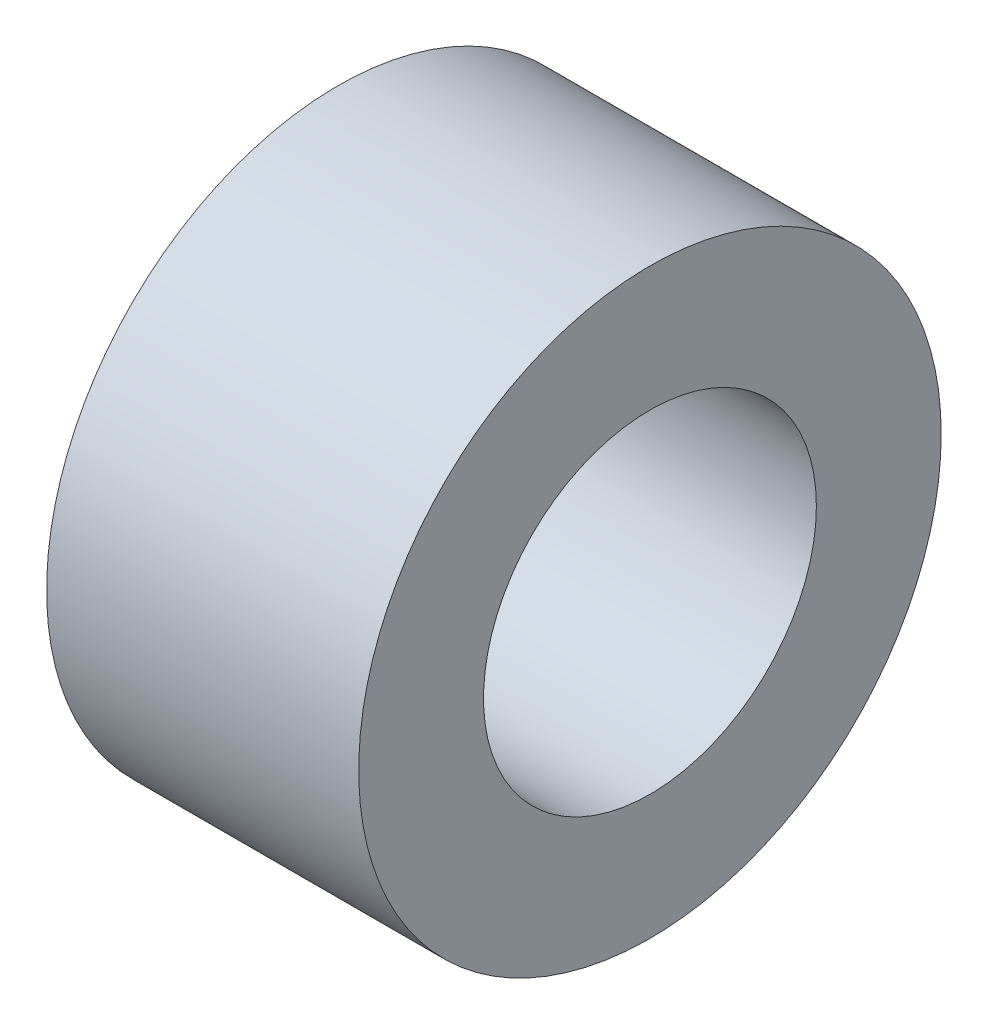
ISO-10303-21;
HEADER;
FILE_DESCRIPTION(('STEP AP214'),'2;1');
FILE_NAME('part.step','',(''),(''),'','','');
FILE_SCHEMA(('AUTOMOTIVE_DESIGN { 1 0 10303 214 1 1 1 1 }'));
ENDSEC;
DATA;
#1=APPLICATION_CONTEXT('core data for automotive mechanical design processes');
#2=APPLICATION_PROTOCOL_DEFINITION('international standard','automotive_design',2000,#1);
#3=PRODUCT_CONTEXT('',#1,'mechanical');
#4=PRODUCT('Part','Part','',(#3));
#5=PRODUCT_RELATED_PRODUCT_CATEGORY('part','',(#4));
#6=PRODUCT_DEFINITION_FORMATION('','',#4);
#7=PRODUCT_DEFINITION_CONTEXT('part definition',#1,'design');
#8=PRODUCT_DEFINITION('design','',#6,#7);
#9=PRODUCT_DEFINITION_SHAPE('','',#8);
#10=(LENGTH_UNIT() NAMED_UNIT(*) SI_UNIT(.MILLI.,.METRE.));
#11=(NAMED_UNIT(*) PLANE_ANGLE_UNIT() SI_UNIT($,.RADIAN.));
#12=(NAMED_UNIT(*) SI_UNIT($,.STERADIAN.) SOLID_ANGLE_UNIT());
#13=UNCERTAINTY_MEASURE_WITH_UNIT(LENGTH_MEASURE(1.E-05),#10,'distance_accuracy_value','');
#14=(GEOMETRIC_REPRESENTATION_CONTEXT(3) GLOBAL_UNCERTAINTY_ASSIGNED_CONTEXT((#13)) GLOBAL_UNIT_ASSIGNED_CONTEXT((#10,
#11,#12)) REPRESENTATION_CONTEXT('',''));
#15=CARTESIAN_POINT('',(0.,0.,0.));
#16=DIRECTION('',(0.,0.,1.));
#17=DIRECTION('',(1.,0.,0.));
#18=AXIS2_PLACEMENT_3D('',#15,#16,#17);
#19=CARTESIAN_POINT('',(14.7,4.59674120458586,37.2747474683058));
#20=DIRECTION('',(1.,0.,0.));
#21=DIRECTION('',(0.,0.,-1.));
#22=AXIS2_PLACEMENT_3D('',#19,#20,#21);
#23=PLANE('',#22);
#24=CARTESIAN_POINT('',(14.7,4.59674120458586,37.2747474683058));
#25=DIRECTION('',(1.,0.,0.));
#26=DIRECTION('',(0.,0.,-1.));
#27=AXIS2_PLACEMENT_3D('',#24,#25,#26);
#28=CIRCLE('',#27,2.8);
#29=CARTESIAN_POINT('',(14.7,4.59674120458586,34.4747474683058));
#30=VERTEX_POINT('',#29);
#31=EDGE_CURVE('E50',#30,#30,#28,.T.);
#32=ORIENTED_EDGE('',*,*,#31,.T.);
#33=EDGE_LOOP('',(#32));
#34=FACE_BOUND('',#33,.T.);
#35=CARTESIAN_POINT('',(14.7,4.59674120458586,37.2747474683058));
#36=DIRECTION('',(1.,0.,0.));
#37=DIRECTION('',(0.,0.,-1.));
#38=AXIS2_PLACEMENT_3D('',#35,#36,#37);
#39=CIRCLE('',#38,1.6);
#40=CARTESIAN_POINT('',(14.7,4.59674120458586,35.6747474683058));
#41=VERTEX_POINT('',#40);
#42=EDGE_CURVE('E41',#41,#41,#39,.T.);
#43=ORIENTED_EDGE('',*,*,#42,.F.);
#44=EDGE_LOOP('',(#43));
#45=FACE_BOUND('',#44,.T.);
#46=ADVANCED_FACE('F37',(#34,#45),#23,.T.);
#47=CARTESIAN_POINT('',(11.7,4.59674120458586,37.2747474683058));
#48=DIRECTION('',(1.,0.,0.));
#49=DIRECTION('',(0.,0.,-1.));
#50=AXIS2_PLACEMENT_3D('',#47,#48,#49);
#51=PLANE('',#50);
#52=CARTESIAN_POINT('',(11.7,4.59674120458586,37.2747474683058));
#53=DIRECTION('',(1.,0.,0.));
#54=DIRECTION('',(0.,0.,-1.));
#55=AXIS2_PLACEMENT_3D('',#52,#53,#54);
#56=CIRCLE('',#55,2.8);
#57=CARTESIAN_POINT('',(11.7,4.59674120458586,34.4747474683058));
#58=VERTEX_POINT('',#57);
#59=EDGE_CURVE('E48',#58,#58,#56,.T.);
#60=ORIENTED_EDGE('',*,*,#59,.F.);
#61=EDGE_LOOP('',(#60));
#62=FACE_BOUND('',#61,.T.);
#63=CARTESIAN_POINT('',(11.7,4.59674120458586,37.2747474683058));
#64=DIRECTION('',(1.,0.,0.));
#65=DIRECTION('',(0.,0.,-1.));
#66=AXIS2_PLACEMENT_3D('',#63,#64,#65);
#67=CIRCLE('',#66,1.6);
#68=CARTESIAN_POINT('',(11.7,4.59674120458586,35.6747474683058));
#69=VERTEX_POINT('',#68);
#70=EDGE_CURVE('E10',#69,#69,#67,.T.);
#71=ORIENTED_EDGE('',*,*,#70,.T.);
#72=EDGE_LOOP('',(#71));
#73=FACE_BOUND('',#72,.T.);
#74=ADVANCED_FACE('F58',(#62,#73),#51,.F.);
#75=CARTESIAN_POINT('',(14.7,4.59674120458586,37.2747474683058));
#76=DIRECTION('',(-1.,0.,0.));
#77=DIRECTION('',(0.,0.,1.));
#78=AXIS2_PLACEMENT_3D('',#75,#76,#77);
#79=CYLINDRICAL_SURFACE('',#78,2.8);
#80=ORIENTED_EDGE('',*,*,#31,.F.);
#81=EDGE_LOOP('',(#80));
#82=FACE_BOUND('',#81,.T.);
#83=ORIENTED_EDGE('',*,*,#59,.T.);
#84=EDGE_LOOP('',(#83));
#85=FACE_BOUND('',#84,.T.);
#86=ADVANCED_FACE('F56',(#82,#85),#79,.T.);
#87=CARTESIAN_POINT('',(14.7,4.59674120458586,37.2747474683058));
#88=DIRECTION('',(-1.,0.,0.));
#89=DIRECTION('',(0.,0.,1.));
#90=AXIS2_PLACEMENT_3D('',#87,#88,#89);
#91=CYLINDRICAL_SURFACE('',#90,1.6);
#92=ORIENTED_EDGE('',*,*,#42,.T.);
#93=EDGE_LOOP('',(#92));
#94=FACE_BOUND('',#93,.T.);
#95=ORIENTED_EDGE('',*,*,#70,.F.);
#96=EDGE_LOOP('',(#95));
#97=FACE_BOUND('',#96,.T.);
#98=ADVANCED_FACE('F39',(#94,#97),#91,.F.);
#99=CLOSED_SHELL('',(#46,#74,#86,#98));
#100=MANIFOLD_SOLID_BREP('B2',#99);
#101=ADVANCED_BREP_SHAPE_REPRESENTATION('',(#18,#100),#14);
#102=SHAPE_DEFINITION_REPRESENTATION(#9,#101);
ENDSEC;
END-ISO-10303-21;
